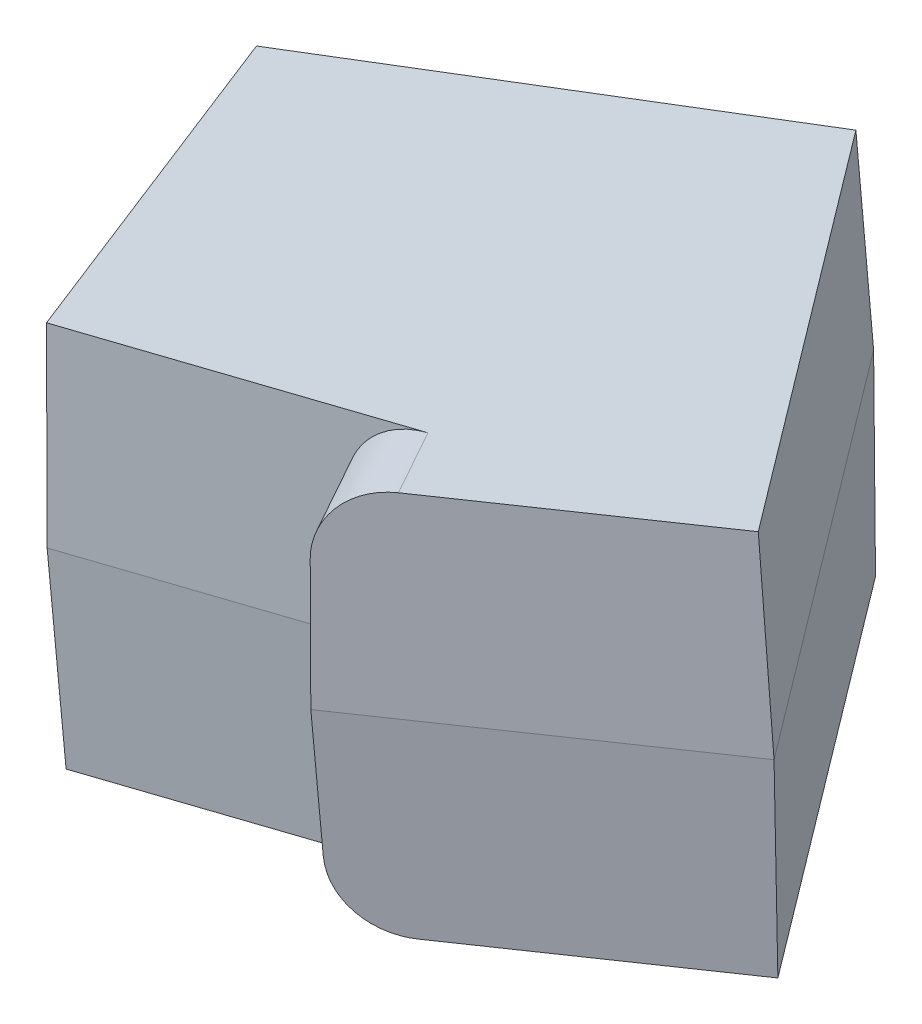
ISO-10303-21;
HEADER;
FILE_DESCRIPTION(('STEP AP214'),'2;1');
FILE_NAME('part.step','',(''),(''),'','','');
FILE_SCHEMA(('AUTOMOTIVE_DESIGN { 1 0 10303 214 1 1 1 1 }'));
ENDSEC;
DATA;
#1=APPLICATION_CONTEXT('core data for automotive mechanical design processes');
#2=APPLICATION_PROTOCOL_DEFINITION('international standard','automotive_design',2000,#1);
#3=PRODUCT_CONTEXT('',#1,'mechanical');
#4=PRODUCT('Part','Part','',(#3));
#5=PRODUCT_RELATED_PRODUCT_CATEGORY('part','',(#4));
#6=PRODUCT_DEFINITION_FORMATION('','',#4);
#7=PRODUCT_DEFINITION_CONTEXT('part definition',#1,'design');
#8=PRODUCT_DEFINITION('design','',#6,#7);
#9=PRODUCT_DEFINITION_SHAPE('','',#8);
#10=(LENGTH_UNIT() NAMED_UNIT(*) SI_UNIT(.MILLI.,.METRE.));
#11=(NAMED_UNIT(*) PLANE_ANGLE_UNIT() SI_UNIT($,.RADIAN.));
#12=(NAMED_UNIT(*) SI_UNIT($,.STERADIAN.) SOLID_ANGLE_UNIT());
#13=UNCERTAINTY_MEASURE_WITH_UNIT(LENGTH_MEASURE(1.E-05),#10,'distance_accuracy_value','');
#14=(GEOMETRIC_REPRESENTATION_CONTEXT(3) GLOBAL_UNCERTAINTY_ASSIGNED_CONTEXT((#13)) GLOBAL_UNIT_ASSIGNED_CONTEXT((#10,
#11,#12)) REPRESENTATION_CONTEXT('',''));
#15=CARTESIAN_POINT('',(0.,0.,0.));
#16=DIRECTION('',(0.,0.,1.));
#17=DIRECTION('',(1.,0.,0.));
#18=AXIS2_PLACEMENT_3D('',#15,#16,#17);
#19=CARTESIAN_POINT('',(332.950507485943,129.488307538545,868.107568513567));
#20=DIRECTION('',(-0.485035754319185,0.00505280840645855,-0.874479723126401));
#21=DIRECTION('',(-0.874490886455444,0.,0.485041946130819));
#22=AXIS2_PLACEMENT_3D('',#19,#20,#21);
#23=CYLINDRICAL_SURFACE('',#22,6.);
#24=CARTESIAN_POINT('',(355.515344749584,129.253240745219,908.790121226404));
#25=DIRECTION('',(0.521760025133477,0.0226811139966737,0.852790738247422));
#26=DIRECTION('',(0.708811646553024,0.544739005960206,-0.448157857340779));
#27=AXIS2_PLACEMENT_3D('',#24,#25,#26);
#28=ELLIPSE('',#27,6.00777482536505,6.);
#29=CARTESIAN_POINT('',(355.265117202278,135.250079711312,908.783723107154));
#30=VERTEX_POINT('',#29);
#31=CARTESIAN_POINT('',(350.393528990673,129.193254800814,911.925379557934));
#32=VERTEX_POINT('',#31);
#33=EDGE_CURVE('E20',#30,#32,#28,.T.);
#34=ORIENTED_EDGE('',*,*,#33,.F.);
#35=DIRECTION('',(-0.485035754319064,0.00505280840646103,-0.874479723126468));
#36=VECTOR('',#35,1.);
#37=CARTESIAN_POINT('',(355.265117202278,135.250079711312,908.783723107155));
#38=LINE('',#37,#36);
#39=CARTESIAN_POINT('',(351.923515749506,135.284890489201,902.75908948541));
#40=VERTEX_POINT('',#39);
#41=EDGE_CURVE('E97',#30,#40,#38,.T.);
#42=ORIENTED_EDGE('',*,*,#41,.T.);
#43=CARTESIAN_POINT('',(352.175675243785,129.288031397256,902.768970746758));
#44=DIRECTION('',(0.27514055070389,0.0131532684200157,0.961314032399523));
#45=DIRECTION('',(-0.958684442495117,0.0789097375433032,0.273308238146372));
#46=AXIS2_PLACEMENT_3D('',#43,#44,#45);
#47=ELLIPSE('',#46,6.15993550280932,6.);
#48=CARTESIAN_POINT('',(346.255144015075,129.236365986346,904.464210529826));
#49=VERTEX_POINT('',#48);
#50=EDGE_CURVE('E107',#49,#40,#47,.F.);
#51=ORIENTED_EDGE('',*,*,#50,.F.);
#52=DIRECTION('',(-0.485035754319185,0.00505280840651703,-0.8744797231264));
#53=VECTOR('',#52,1.);
#54=CARTESIAN_POINT('',(350.393528990673,129.193254800814,911.925379557934));
#55=LINE('',#54,#53);
#56=EDGE_CURVE('E102',#32,#49,#55,.T.);
#57=ORIENTED_EDGE('',*,*,#56,.F.);
#58=EDGE_LOOP('',(#34,#42,#51,#57));
#59=FACE_BOUND('',#58,.T.);
#60=ADVANCED_FACE('F17',(#59),#23,.T.);
#61=CARTESIAN_POINT('',(350.619352869359,117.531292600389,912.09738004398));
#62=DIRECTION('',(-0.874473028328217,-0.00978058945485272,0.484975528038676));
#63=DIRECTION('',(0.484998726065583,0.,0.874514857343637));
#64=AXIS2_PLACEMENT_3D('',#61,#62,#63);
#65=PLANE('',#64);
#66=DIRECTION('',(-0.0161983832775512,0.999827893955455,-0.00904405040860746));
#67=VECTOR('',#66,1.);
#68=CARTESIAN_POINT('',(346.444075239324,117.574788111226,904.569696582759));
#69=LINE('',#68,#67);
#70=CARTESIAN_POINT('',(346.444075239324,117.574788111226,904.569696582759));
#71=VERTEX_POINT('',#70);
#72=EDGE_CURVE('E119',#71,#49,#69,.T.);
#73=ORIENTED_EDGE('',*,*,#72,.F.);
#74=DIRECTION('',(-0.485035754319186,0.00505280840645477,-0.8744797231264));
#75=VECTOR('',#74,1.);
#76=CARTESIAN_POINT('',(350.619352869359,117.531292600389,912.09738004398));
#77=LINE('',#76,#75);
#78=CARTESIAN_POINT('',(350.619352869359,117.531292600389,912.09738004398));
#79=VERTEX_POINT('',#78);
#80=EDGE_CURVE('E115',#79,#71,#77,.T.);
#81=ORIENTED_EDGE('',*,*,#80,.F.);
#82=DIRECTION('',(0.019358406790809,-0.999703882373856,0.014744478734799));
#83=VECTOR('',#82,1.);
#84=CARTESIAN_POINT('',(350.393528990673,129.193254800814,911.925379557934));
#85=LINE('',#84,#83);
#86=EDGE_CURVE('E112',#32,#79,#85,.T.);
#87=ORIENTED_EDGE('',*,*,#86,.F.);
#88=ORIENTED_EDGE('',*,*,#56,.T.);
#89=EDGE_LOOP('',(#73,#81,#87,#88));
#90=FACE_BOUND('',#89,.T.);
#91=ADVANCED_FACE('F113',(#90),#65,.T.);
#92=CARTESIAN_POINT('',(327.26748100612,135.257735630712,871.293031568402));
#93=DIRECTION('',(0.028991382839327,-0.999340722518686,-0.0218545198275862));
#94=DIRECTION('',(0.999579460618045,0.0289983087530628,0.));
#95=AXIS2_PLACEMENT_3D('',#92,#93,#94);
#96=PLANE('',#95);
#97=ORIENTED_EDGE('',*,*,#41,.F.);
#98=DIRECTION('',(-0.852024795279419,-0.0361387814467056,0.52225256026621));
#99=VECTOR('',#98,1.);
#100=CARTESIAN_POINT('',(375.524896452771,136.109401809153,896.365397205584));
#101=LINE('',#100,#99);
#102=CARTESIAN_POINT('',(375.524896452771,136.109401809153,896.365397205585));
#103=VERTEX_POINT('',#102);
#104=EDGE_CURVE('E123',#103,#30,#101,.T.);
#105=ORIENTED_EDGE('',*,*,#104,.F.);
#106=DIRECTION('',(-0.601954606178242,0.,-0.798530307565591));
#107=VECTOR('',#106,1.);
#108=CARTESIAN_POINT('',(375.828581287172,136.109401809153,896.768254068425));
#109=LINE('',#108,#107);
#110=CARTESIAN_POINT('',(348.376355144506,136.109401809153,860.351164872545));
#111=VERTEX_POINT('',#110);
#112=EDGE_CURVE('E131',#111,#103,#109,.F.);
#113=ORIENTED_EDGE('',*,*,#112,.F.);
#114=DIRECTION('',(0.878213027005913,0.0359071374714584,-0.476919863997839));
#115=VECTOR('',#114,1.);
#116=CARTESIAN_POINT('',(313.096814058979,134.666941616998,879.509971926204));
#117=LINE('',#116,#115);
#118=CARTESIAN_POINT('',(313.096814058979,134.666941616998,879.509971926204));
#119=VERTEX_POINT('',#118);
#120=EDGE_CURVE('E138',#119,#111,#117,.T.);
#121=ORIENTED_EDGE('',*,*,#120,.F.);
#122=DIRECTION('',(-0.35867623322231,0.0100072696447811,-0.933408385582491));
#123=VECTOR('',#122,1.);
#124=CARTESIAN_POINT('',(324.997049543747,134.334918320493,910.478791611015));
#125=LINE('',#124,#123);
#126=CARTESIAN_POINT('',(324.997049543748,134.334918320493,910.478791611015));
#127=VERTEX_POINT('',#126);
#128=EDGE_CURVE('E143',#127,#119,#125,.T.);
#129=ORIENTED_EDGE('',*,*,#128,.F.);
#130=DIRECTION('',(-0.96072201678059,-0.0338945025623683,0.275434872826746));
#131=VECTOR('',#130,1.);
#132=CARTESIAN_POINT('',(351.923515749506,135.284890489201,902.75908948541));
#133=LINE('',#132,#131);
#134=EDGE_CURVE('E157',#40,#127,#133,.T.);
#135=ORIENTED_EDGE('',*,*,#134,.F.);
#136=EDGE_LOOP('',(#97,#105,#113,#121,#129,#135));
#137=FACE_BOUND('',#136,.T.);
#138=ADVANCED_FACE('F282',(#137),#96,.F.);
#139=CARTESIAN_POINT('',(376.70161864792,118.637576487699,896.110133949891));
#140=DIRECTION('',(0.521760025133477,0.0226811139966737,0.852790738247422));
#141=DIRECTION('',(0.853010174735054,0.,-0.521894282205191));
#142=AXIS2_PLACEMENT_3D('',#139,#140,#141);
#143=PLANE('',#142);
#144=DIRECTION('',(-0.852024795279419,-0.0361387814467016,0.522252560266211));
#145=VECTOR('',#144,1.);
#146=CARTESIAN_POINT('',(376.70161864792,118.637576487699,896.110133949891));
#147=LINE('',#146,#145);
#148=CARTESIAN_POINT('',(376.70161864792,118.637576487699,896.110133949891));
#149=VERTEX_POINT('',#148);
#150=EDGE_CURVE('E156',#149,#79,#147,.T.);
#151=ORIENTED_EDGE('',*,*,#150,.F.);
#152=DIRECTION('',(0.0671903310563894,-0.997633708574412,-0.0145754220726948));
#153=VECTOR('',#152,1.);
#154=CARTESIAN_POINT('',(375.524896452771,136.109401809153,896.365397205585));
#155=LINE('',#154,#153);
#156=EDGE_CURVE('E134',#103,#149,#155,.T.);
#157=ORIENTED_EDGE('',*,*,#156,.F.);
#158=ORIENTED_EDGE('',*,*,#104,.T.);
#159=ORIENTED_EDGE('',*,*,#33,.T.);
#160=ORIENTED_EDGE('',*,*,#86,.T.);
#161=EDGE_LOOP('',(#151,#157,#158,#159,#160));
#162=FACE_BOUND('',#161,.T.);
#163=ADVANCED_FACE('F121',(#162),#143,.T.);
#164=CARTESIAN_POINT('',(325.227455225526,116.826260682,910.652410347243));
#165=DIRECTION('',(0.27514055070389,0.0131532684200157,0.961314032399523));
#166=DIRECTION('',(0.961397200926353,0.,-0.275164354615517));
#167=AXIS2_PLACEMENT_3D('',#164,#165,#166);
#168=PLANE('',#167);
#169=ORIENTED_EDGE('',*,*,#134,.T.);
#170=DIRECTION('',(-0.0131577425822853,0.999864275876333,-0.00991481903189544));
#171=VECTOR('',#170,1.);
#172=CARTESIAN_POINT('',(325.227455225525,116.826260682,910.652410347243));
#173=LINE('',#172,#171);
#174=CARTESIAN_POINT('',(325.227455225525,116.826260682,910.652410347243));
#175=VERTEX_POINT('',#174);
#176=EDGE_CURVE('E145',#175,#127,#173,.T.);
#177=ORIENTED_EDGE('',*,*,#176,.F.);
#178=DIRECTION('',(-0.960722016780591,-0.0338945025623286,0.275434872826746));
#179=VECTOR('',#178,1.);
#180=CARTESIAN_POINT('',(346.444075239324,117.574788111226,904.569696582759));
#181=LINE('',#180,#179);
#182=EDGE_CURVE('E152',#71,#175,#181,.T.);
#183=ORIENTED_EDGE('',*,*,#182,.F.);
#184=ORIENTED_EDGE('',*,*,#72,.T.);
#185=ORIENTED_EDGE('',*,*,#50,.T.);
#186=EDGE_LOOP('',(#169,#177,#183,#184,#185));
#187=FACE_BOUND('',#186,.T.);
#188=ADVANCED_FACE('F269',(#187),#168,.T.);
#189=CARTESIAN_POINT('',(350.619352869359,117.531292600389,912.09738004398));
#190=DIRECTION('',(-0.872955216468299,-0.0620999703255013,0.483831358767036));
#191=DIRECTION('',(0.484766990925236,0.,0.874643335599885));
#192=AXIS2_PLACEMENT_3D('',#189,#190,#191);
#193=PLANE('',#192);
#194=DIRECTION('',(0.0385828312597129,-0.997546094212625,-0.0584222136958286));
#195=VECTOR('',#194,1.);
#196=CARTESIAN_POINT('',(350.619352869359,117.531292600389,912.097380043979));
#197=LINE('',#196,#195);
#198=CARTESIAN_POINT('',(351.069437667137,105.894501897661,911.415860586269));
#199=VERTEX_POINT('',#198);
#200=EDGE_CURVE('E211',#79,#199,#197,.T.);
#201=ORIENTED_EDGE('',*,*,#200,.F.);
#202=ORIENTED_EDGE('',*,*,#80,.T.);
#203=DIRECTION('',(-0.0417519520656595,0.997735668746341,0.052728643164781));
#204=VECTOR('',#203,1.);
#205=CARTESIAN_POINT('',(346.931052691539,105.937613083192,903.954691558162));
#206=LINE('',#205,#204);
#207=CARTESIAN_POINT('',(346.931052691539,105.937613083192,903.954691558161));
#208=VERTEX_POINT('',#207);
#209=EDGE_CURVE('E151',#208,#71,#206,.T.);
#210=ORIENTED_EDGE('',*,*,#209,.F.);
#211=DIRECTION('',(0.485035754319185,-0.00505280840645855,0.874479723126401));
#212=VECTOR('',#211,1.);
#213=CARTESIAN_POINT('',(351.224100655989,105.892890712417,911.694705282695));
#214=LINE('',#213,#212);
#215=EDGE_CURVE('E155',#199,#208,#214,.F.);
#216=ORIENTED_EDGE('',*,*,#215,.F.);
#217=EDGE_LOOP('',(#201,#202,#210,#216));
#218=FACE_BOUND('',#217,.T.);
#219=ADVANCED_FACE('F271',(#218),#193,.T.);
#220=CARTESIAN_POINT('',(313.032463295967,117.166507849922,878.916525237439));
#221=DIRECTION('',(-0.933450900643757,-0.00872784708129121,0.358598997171889));
#222=DIRECTION('',(0.358612656147977,0.,0.933486455633124));
#223=AXIS2_PLACEMENT_3D('',#220,#221,#222);
#224=PLANE('',#223);
#225=ORIENTED_EDGE('',*,*,#128,.T.);
#226=DIRECTION('',(0.00367495814660764,0.999418789012845,0.0338906897350709));
#227=VECTOR('',#226,1.);
#228=CARTESIAN_POINT('',(313.032463295967,117.166507849922,878.916525237439));
#229=LINE('',#228,#227);
#230=CARTESIAN_POINT('',(313.032463295967,117.166507849922,878.916525237439));
#231=VERTEX_POINT('',#230);
#232=EDGE_CURVE('E140',#231,#119,#229,.T.);
#233=ORIENTED_EDGE('',*,*,#232,.F.);
#234=DIRECTION('',(-0.358676233222309,0.010007269644766,-0.933408385582491));
#235=VECTOR('',#234,1.);
#236=CARTESIAN_POINT('',(325.227455225525,116.826260682,910.652410347243));
#237=LINE('',#236,#235);
#238=EDGE_CURVE('E187',#175,#231,#237,.T.);
#239=ORIENTED_EDGE('',*,*,#238,.F.);
#240=ORIENTED_EDGE('',*,*,#176,.T.);
#241=EDGE_LOOP('',(#225,#233,#239,#240));
#242=FACE_BOUND('',#241,.T.);
#243=ADVANCED_FACE('F264',(#242),#224,.T.);
#244=CARTESIAN_POINT('',(349.011706763721,118.637576487699,859.377739801874));
#245=DIRECTION('',(-0.477985490959105,0.0315242091692893,-0.877801853876394));
#246=DIRECTION('',(-0.878238348340442,0.,0.478223173324183));
#247=AXIS2_PLACEMENT_3D('',#244,#245,#246);
#248=PLANE('',#247);
#249=ORIENTED_EDGE('',*,*,#120,.T.);
#250=DIRECTION('',(-0.0362841371033807,0.997794113113275,0.0555910894942365));
#251=VECTOR('',#250,1.);
#252=CARTESIAN_POINT('',(349.011706763721,118.637576487699,859.377739801874));
#253=LINE('',#252,#251);
#254=CARTESIAN_POINT('',(349.011706763721,118.637576487699,859.377739801874));
#255=VERTEX_POINT('',#254);
#256=EDGE_CURVE('E135',#255,#111,#253,.T.);
#257=ORIENTED_EDGE('',*,*,#256,.F.);
#258=DIRECTION('',(0.878213027005913,0.0359071374714553,-0.47691986399784));
#259=VECTOR('',#258,1.);
#260=CARTESIAN_POINT('',(313.032463295967,117.166507849922,878.916525237439));
#261=LINE('',#260,#259);
#262=EDGE_CURVE('E184',#231,#255,#261,.T.);
#263=ORIENTED_EDGE('',*,*,#262,.F.);
#264=ORIENTED_EDGE('',*,*,#232,.T.);
#265=EDGE_LOOP('',(#249,#257,#263,#264));
#266=FACE_BOUND('',#265,.T.);
#267=ADVANCED_FACE('F285',(#266),#248,.T.);
#268=CARTESIAN_POINT('',(376.70161864792,118.637576487699,896.110133949891));
#269=DIRECTION('',(0.796971492595355,0.062453176032463,-0.600779527608747));
#270=DIRECTION('',(-0.601954606178242,0.,-0.798530307565591));
#271=AXIS2_PLACEMENT_3D('',#268,#269,#270);
#272=PLANE('',#271);
#273=ORIENTED_EDGE('',*,*,#112,.T.);
#274=ORIENTED_EDGE('',*,*,#156,.T.);
#275=DIRECTION('',(-0.601954606178243,0.,-0.79853030756559));
#276=VECTOR('',#275,1.);
#277=CARTESIAN_POINT('',(376.70161864792,118.637576487699,896.110133949891));
#278=LINE('',#277,#276);
#279=EDGE_CURVE('E183',#255,#149,#278,.F.);
#280=ORIENTED_EDGE('',*,*,#279,.F.);
#281=ORIENTED_EDGE('',*,*,#256,.T.);
#282=EDGE_LOOP('',(#273,#274,#280,#281));
#283=FACE_BOUND('',#282,.T.);
#284=ADVANCED_FACE('F279',(#283),#272,.T.);
#285=CARTESIAN_POINT('',(376.70161864792,118.637576487699,896.110133949891));
#286=DIRECTION('',(0.523277836993394,-0.029638266873975,0.851646568975782));
#287=DIRECTION('',(0.852020870203141,0.,-0.523507819175876));
#288=AXIS2_PLACEMENT_3D('',#285,#286,#287);
#289=PLANE('',#288);
#290=DIRECTION('',(-0.00925148902759912,-0.999533676501491,-0.0291005066997798));
#291=VECTOR('',#290,1.);
#292=CARTESIAN_POINT('',(376.70161864792,118.637576487699,896.110133949891));
#293=LINE('',#292,#291);
#294=CARTESIAN_POINT('',(376.539594852148,101.132476520999,895.600489011619));
#295=VERTEX_POINT('',#294);
#296=EDGE_CURVE('E199',#149,#295,#293,.T.);
#297=ORIENTED_EDGE('',*,*,#296,.F.);
#298=ORIENTED_EDGE('',*,*,#150,.T.);
#299=ORIENTED_EDGE('',*,*,#200,.T.);
#300=CARTESIAN_POINT('',(356.182146554888,106.268404127289,908.287467270369));
#301=DIRECTION('',(0.523277836993394,-0.029638266873975,0.851646568975782));
#302=DIRECTION('',(-0.738616885187005,0.482655543530644,0.470625884557772));
#303=AXIS2_PLACEMENT_3D('',#300,#301,#302);
#304=ELLIPSE('',#303,6.00777482536505,6.);
#305=CARTESIAN_POINT('',(356.279815601654,100.273154423158,908.018814913189));
#306=VERTEX_POINT('',#305);
#307=EDGE_CURVE('E153',#306,#199,#304,.F.);
#308=ORIENTED_EDGE('',*,*,#307,.F.);
#309=DIRECTION('',(-0.852024795279427,-0.0361387814466999,0.522252560266196));
#310=VECTOR('',#309,1.);
#311=CARTESIAN_POINT('',(376.539594852148,101.132476520999,895.600489011619));
#312=LINE('',#311,#310);
#313=EDGE_CURVE('E198',#295,#306,#312,.T.);
#314=ORIENTED_EDGE('',*,*,#313,.F.);
#315=EDGE_LOOP('',(#297,#298,#299,#308,#314));
#316=FACE_BOUND('',#315,.T.);
#317=ADVANCED_FACE('F275',(#316),#289,.T.);
#318=CARTESIAN_POINT('',(356.461831954799,106.265490534369,908.791717130093));
#319=DIRECTION('',(0.485035754319185,-0.00505280840645855,0.874479723126401));
#320=DIRECTION('',(0.874490886455444,0.,-0.485041946130819));
#321=AXIS2_PLACEMENT_3D('',#318,#319,#320);
#322=CYLINDRICAL_SURFACE('',#321,6.);
#323=ORIENTED_EDGE('',*,*,#307,.T.);
#324=ORIENTED_EDGE('',*,*,#215,.T.);
#325=CARTESIAN_POINT('',(352.84247704909,106.303194779326,902.266316790724));
#326=DIRECTION('',(0.276658362563807,-0.0391661124506329,0.960169863127883));
#327=DIRECTION('',(0.952154172815082,0.146190405366593,-0.268385537184063));
#328=AXIS2_PLACEMENT_3D('',#325,#326,#327);
#329=ELLIPSE('',#328,6.15993550280933,6.);
#330=CARTESIAN_POINT('',(352.938214148882,100.307965201046,901.994181291445));
#331=VERTEX_POINT('',#330);
#332=EDGE_CURVE('E148',#331,#208,#329,.F.);
#333=ORIENTED_EDGE('',*,*,#332,.F.);
#334=DIRECTION('',(-0.485035754319119,0.00505280840646169,-0.874479723126438));
#335=VECTOR('',#334,1.);
#336=CARTESIAN_POINT('',(356.279815601654,100.273154423158,908.018814913189));
#337=LINE('',#336,#335);
#338=EDGE_CURVE('E232',#306,#331,#337,.T.);
#339=ORIENTED_EDGE('',*,*,#338,.F.);
#340=EDGE_LOOP('',(#323,#324,#333,#339));
#341=FACE_BOUND('',#340,.T.);
#342=ADVANCED_FACE('F310',(#341),#322,.T.);
#343=CARTESIAN_POINT('',(325.227455225526,116.826260682,910.652410347243));
#344=DIRECTION('',(0.276658362563807,-0.0391661124506329,0.960169863127883));
#345=DIRECTION('',(0.96090715425985,0.,-0.27687080180517));
#346=AXIS2_PLACEMENT_3D('',#343,#344,#345);
#347=PLANE('',#346);
#348=ORIENTED_EDGE('',*,*,#332,.T.);
#349=ORIENTED_EDGE('',*,*,#209,.T.);
#350=ORIENTED_EDGE('',*,*,#182,.T.);
#351=DIRECTION('',(-0.0447884861505768,0.997557730864643,0.0535963161096299));
#352=VECTOR('',#351,1.);
#353=CARTESIAN_POINT('',(326.011747943124,99.3579930323394,909.71388341705));
#354=LINE('',#353,#352);
#355=CARTESIAN_POINT('',(326.011747943124,99.3579930323396,909.71388341705));
#356=VERTEX_POINT('',#355);
#357=EDGE_CURVE('E190',#356,#175,#354,.T.);
#358=ORIENTED_EDGE('',*,*,#357,.F.);
#359=DIRECTION('',(-0.960722016780591,-0.0338945025623373,0.275434872826747));
#360=VECTOR('',#359,1.);
#361=CARTESIAN_POINT('',(352.938214148882,100.307965201047,901.994181291445));
#362=LINE('',#361,#360);
#363=EDGE_CURVE('E243',#331,#356,#362,.T.);
#364=ORIENTED_EDGE('',*,*,#363,.F.);
#365=EDGE_LOOP('',(#348,#349,#350,#358,#364));
#366=FACE_BOUND('',#365,.T.);
#367=ADVANCED_FACE('F266',(#366),#347,.T.);
#368=CARTESIAN_POINT('',(313.032463295967,117.166507849922,878.916525237439));
#369=DIRECTION('',(-0.931933088783839,-0.0610472279519398,0.357454827900249));
#370=DIRECTION('',(0.358122770328387,0.,0.933674505045694));
#371=AXIS2_PLACEMENT_3D('',#368,#369,#370);
#372=PLANE('',#371);
#373=DIRECTION('',(-0.358676233222296,0.0100072696447591,-0.933408385582496));
#374=VECTOR('',#373,1.);
#375=CARTESIAN_POINT('',(326.011747943124,99.3579930323396,909.71388341705));
#376=LINE('',#375,#374);
#377=CARTESIAN_POINT('',(314.111512458356,99.6900163288437,878.745063732238));
#378=VERTEX_POINT('',#377);
#379=EDGE_CURVE('E240',#356,#378,#376,.T.);
#380=ORIENTED_EDGE('',*,*,#379,.F.);
#381=ORIENTED_EDGE('',*,*,#357,.T.);
#382=ORIENTED_EDGE('',*,*,#238,.T.);
#383=DIRECTION('',(-0.0616225872748944,0.998051489732135,0.00979186300013602));
#384=VECTOR('',#383,1.);
#385=CARTESIAN_POINT('',(314.111512458356,99.6900163288437,878.745063732238));
#386=LINE('',#385,#384);
#387=EDGE_CURVE('E180',#378,#231,#386,.T.);
#388=ORIENTED_EDGE('',*,*,#387,.F.);
#389=EDGE_LOOP('',(#380,#381,#382,#388));
#390=FACE_BOUND('',#389,.T.);
#391=ADVANCED_FACE('F261',(#390),#372,.T.);
#392=CARTESIAN_POINT('',(349.011706763721,118.637576487699,859.377739801874));
#393=DIRECTION('',(-0.476467679099187,-0.0207951717013593,-0.878946023148035));
#394=DIRECTION('',(-0.879136130150186,0.,0.476570734167086));
#395=AXIS2_PLACEMENT_3D('',#392,#393,#394);
#396=PLANE('',#395);
#397=DIRECTION('',(0.878213027005912,0.0359071374714766,-0.476919863997839));
#398=VECTOR('',#397,1.);
#399=CARTESIAN_POINT('',(314.111512458356,99.6900163288439,878.745063732238));
#400=LINE('',#399,#398);
#401=CARTESIAN_POINT('',(349.391053543882,101.132476520999,859.58625667858));
#402=VERTEX_POINT('',#401);
#403=EDGE_CURVE('E26',#378,#402,#400,.T.);
#404=ORIENTED_EDGE('',*,*,#403,.F.);
#405=ORIENTED_EDGE('',*,*,#387,.T.);
#406=ORIENTED_EDGE('',*,*,#262,.T.);
#407=DIRECTION('',(-0.0216640206223077,0.999694386526704,-0.0119081382874343));
#408=VECTOR('',#407,1.);
#409=CARTESIAN_POINT('',(349.391053543882,101.132476520999,859.58625667858));
#410=LINE('',#409,#408);
#411=EDGE_CURVE('E35',#402,#255,#410,.T.);
#412=ORIENTED_EDGE('',*,*,#411,.F.);
#413=EDGE_LOOP('',(#404,#405,#406,#412));
#414=FACE_BOUND('',#413,.T.);
#415=ADVANCED_FACE('F258',(#414),#396,.T.);
#416=CARTESIAN_POINT('',(376.70161864792,118.637576487699,896.110133949891));
#417=DIRECTION('',(0.798489304455273,0.0101337951618144,-0.601923696880388));
#418=DIRECTION('',(-0.601954606178243,0.,-0.79853030756559));
#419=AXIS2_PLACEMENT_3D('',#416,#417,#418);
#420=PLANE('',#419);
#421=DIRECTION('',(0.601954606178254,0.,0.798530307565582));
#422=VECTOR('',#421,1.);
#423=CARTESIAN_POINT('',(349.391053543882,101.132476521,859.58625667858));
#424=LINE('',#423,#422);
#425=EDGE_CURVE('E11',#402,#295,#424,.T.);
#426=ORIENTED_EDGE('',*,*,#425,.F.);
#427=ORIENTED_EDGE('',*,*,#411,.T.);
#428=ORIENTED_EDGE('',*,*,#279,.T.);
#429=ORIENTED_EDGE('',*,*,#296,.T.);
#430=EDGE_LOOP('',(#426,#427,#428,#429));
#431=FACE_BOUND('',#430,.T.);
#432=ADVANCED_FACE('F296',(#431),#420,.T.);
#433=CARTESIAN_POINT('',(328.282179405496,100.280810342558,870.528123374436));
#434=DIRECTION('',(0.028991382839327,-0.999340722518686,-0.0218545198275862));
#435=DIRECTION('',(0.999579460618045,0.0289983087530628,0.));
#436=AXIS2_PLACEMENT_3D('',#433,#434,#435);
#437=PLANE('',#436);
#438=ORIENTED_EDGE('',*,*,#403,.T.);
#439=ORIENTED_EDGE('',*,*,#425,.T.);
#440=ORIENTED_EDGE('',*,*,#313,.T.);
#441=ORIENTED_EDGE('',*,*,#338,.T.);
#442=ORIENTED_EDGE('',*,*,#363,.T.);
#443=ORIENTED_EDGE('',*,*,#379,.T.);
#444=EDGE_LOOP('',(#438,#439,#440,#441,#442,#443));
#445=FACE_BOUND('',#444,.T.);
#446=ADVANCED_FACE('F256',(#445),#437,.T.);
#447=CLOSED_SHELL('',(#60,#91,#138,#163,#188,#219,#243,#267,#284,#317,#342,#367,#391,#415,#432,#446));
#448=MANIFOLD_SOLID_BREP('B1',#447);
#449=ADVANCED_BREP_SHAPE_REPRESENTATION('',(#18,#448),#14);
#450=SHAPE_DEFINITION_REPRESENTATION(#9,#449);
ENDSEC;
END-ISO-10303-21;
